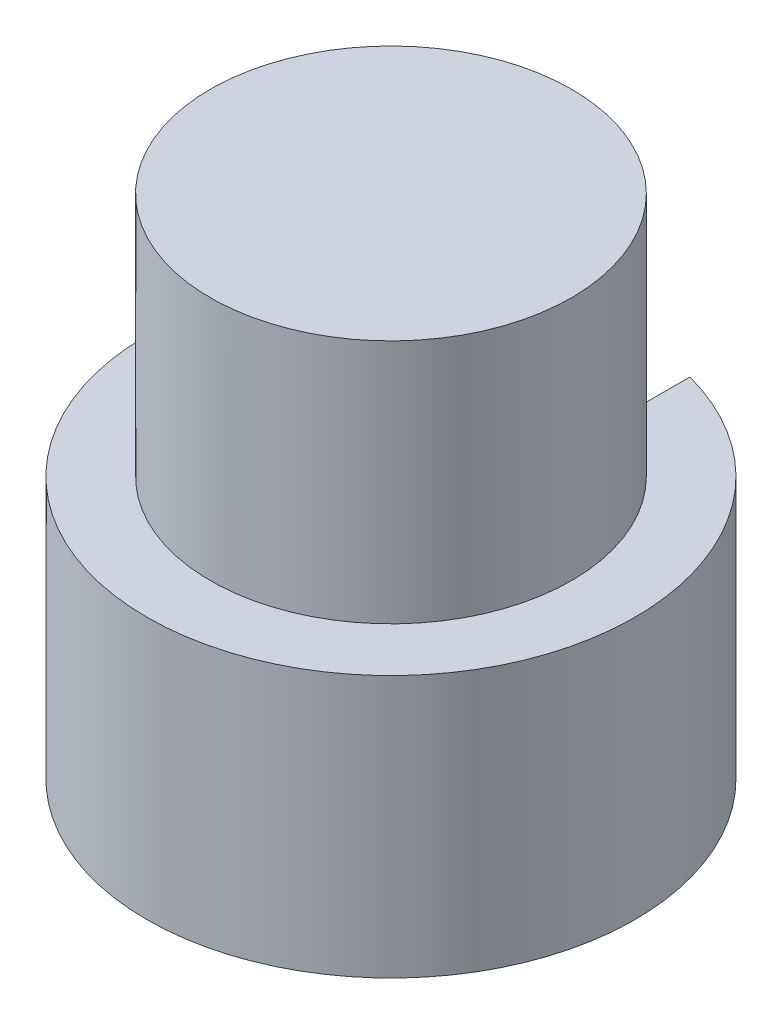
ISO-10303-21;
HEADER;
FILE_DESCRIPTION(('STEP AP214'),'2;1');
FILE_NAME('part.step','',(''),(''),'','','');
FILE_SCHEMA(('AUTOMOTIVE_DESIGN { 1 0 10303 214 1 1 1 1 }'));
ENDSEC;
DATA;
#1=APPLICATION_CONTEXT('core data for automotive mechanical design processes');
#2=APPLICATION_PROTOCOL_DEFINITION('international standard','automotive_design',2000,#1);
#3=PRODUCT_CONTEXT('',#1,'mechanical');
#4=PRODUCT('Part','Part','',(#3));
#5=PRODUCT_RELATED_PRODUCT_CATEGORY('part','',(#4));
#6=PRODUCT_DEFINITION_FORMATION('','',#4);
#7=PRODUCT_DEFINITION_CONTEXT('part definition',#1,'design');
#8=PRODUCT_DEFINITION('design','',#6,#7);
#9=PRODUCT_DEFINITION_SHAPE('','',#8);
#10=(LENGTH_UNIT() NAMED_UNIT(*) SI_UNIT(.MILLI.,.METRE.));
#11=(NAMED_UNIT(*) PLANE_ANGLE_UNIT() SI_UNIT($,.RADIAN.));
#12=(NAMED_UNIT(*) SI_UNIT($,.STERADIAN.) SOLID_ANGLE_UNIT());
#13=UNCERTAINTY_MEASURE_WITH_UNIT(LENGTH_MEASURE(1.E-05),#10,'distance_accuracy_value','');
#14=(GEOMETRIC_REPRESENTATION_CONTEXT(3) GLOBAL_UNCERTAINTY_ASSIGNED_CONTEXT((#13)) GLOBAL_UNIT_ASSIGNED_CONTEXT((#10,
#11,#12)) REPRESENTATION_CONTEXT('',''));
#15=CARTESIAN_POINT('',(0.,0.,0.));
#16=DIRECTION('',(0.,0.,1.));
#17=DIRECTION('',(1.,0.,0.));
#18=AXIS2_PLACEMENT_3D('',#15,#16,#17);
#19=CARTESIAN_POINT('',(0.,12.,0.));
#20=DIRECTION('',(0.,-1.,0.));
#21=DIRECTION('',(0.,0.,1.));
#22=AXIS2_PLACEMENT_3D('',#19,#20,#21);
#23=CYLINDRICAL_SURFACE('',#22,4.275);
#24=CARTESIAN_POINT('',(0.,12.,0.));
#25=DIRECTION('',(0.,-1.,0.));
#26=DIRECTION('',(0.,0.,-1.));
#27=AXIS2_PLACEMENT_3D('',#24,#25,#26);
#28=CIRCLE('',#27,4.275);
#29=CARTESIAN_POINT('',(0.,12.,-4.275));
#30=VERTEX_POINT('',#29);
#31=EDGE_CURVE('E145',#30,#30,#28,.T.);
#32=ORIENTED_EDGE('',*,*,#31,.T.);
#33=EDGE_LOOP('',(#32));
#34=FACE_BOUND('',#33,.T.);
#35=CARTESIAN_POINT('',(0.,6.2,0.));
#36=DIRECTION('',(0.,1.,0.));
#37=DIRECTION('',(0.,0.,1.));
#38=AXIS2_PLACEMENT_3D('',#35,#36,#37);
#39=CIRCLE('',#38,4.275);
#40=CARTESIAN_POINT('',(1.5,6.2,-4.00320184352475));
#41=VERTEX_POINT('',#40);
#42=CARTESIAN_POINT('',(-1.5,6.2,-4.00320184352475));
#43=VERTEX_POINT('',#42);
#44=EDGE_CURVE('E115',#41,#43,#39,.T.);
#45=ORIENTED_EDGE('',*,*,#44,.T.);
#46=EDGE_CURVE('E150',#43,#41,#39,.T.);
#47=ORIENTED_EDGE('',*,*,#46,.T.);
#48=EDGE_LOOP('',(#45,#47));
#49=FACE_BOUND('',#48,.T.);
#50=ADVANCED_FACE('F41',(#34,#49),#23,.T.);
#51=CARTESIAN_POINT('',(0.,12.,0.));
#52=DIRECTION('',(0.,1.,0.));
#53=DIRECTION('',(0.,0.,-1.));
#54=AXIS2_PLACEMENT_3D('',#51,#52,#53);
#55=PLANE('',#54);
#56=ORIENTED_EDGE('',*,*,#31,.F.);
#57=EDGE_LOOP('',(#56));
#58=FACE_BOUND('',#57,.T.);
#59=ADVANCED_FACE('F176',(#58),#55,.T.);
#60=CARTESIAN_POINT('',(0.,6.2,0.));
#61=DIRECTION('',(0.,-1.,0.));
#62=DIRECTION('',(0.,0.,1.));
#63=AXIS2_PLACEMENT_3D('',#60,#61,#62);
#64=CYLINDRICAL_SURFACE('',#63,5.775);
#65=DIRECTION('',(0.,-1.,0.));
#66=VECTOR('',#65,1.);
#67=CARTESIAN_POINT('',(-1.5,6.2,-5.57679343350639));
#68=LINE('',#67,#66);
#69=CARTESIAN_POINT('',(-1.5,6.2,-5.57679343350639));
#70=VERTEX_POINT('',#69);
#71=CARTESIAN_POINT('',(-1.5,0.,-5.57679343350639));
#72=VERTEX_POINT('',#71);
#73=EDGE_CURVE('E132',#70,#72,#68,.T.);
#74=ORIENTED_EDGE('',*,*,#73,.T.);
#75=CARTESIAN_POINT('',(0.,0.,0.));
#76=DIRECTION('',(0.,1.,0.));
#77=DIRECTION('',(0.,0.,1.));
#78=AXIS2_PLACEMENT_3D('',#75,#76,#77);
#79=CIRCLE('',#78,5.775);
#80=CARTESIAN_POINT('',(1.5,0.,-5.57679343350639));
#81=VERTEX_POINT('',#80);
#82=EDGE_CURVE('E139',#72,#81,#79,.T.);
#83=ORIENTED_EDGE('',*,*,#82,.T.);
#84=DIRECTION('',(0.,-1.,0.));
#85=VECTOR('',#84,1.);
#86=CARTESIAN_POINT('',(1.5,6.2,-5.57679343350639));
#87=LINE('',#86,#85);
#88=CARTESIAN_POINT('',(1.5,6.2,-5.57679343350639));
#89=VERTEX_POINT('',#88);
#90=EDGE_CURVE('E127',#81,#89,#87,.F.);
#91=ORIENTED_EDGE('',*,*,#90,.T.);
#92=CARTESIAN_POINT('',(0.,6.2,0.));
#93=DIRECTION('',(0.,1.,0.));
#94=DIRECTION('',(0.,0.,1.));
#95=AXIS2_PLACEMENT_3D('',#92,#93,#94);
#96=CIRCLE('',#95,5.775);
#97=EDGE_CURVE('E142',#70,#89,#96,.T.);
#98=ORIENTED_EDGE('',*,*,#97,.F.);
#99=EDGE_LOOP('',(#74,#83,#91,#98));
#100=FACE_BOUND('',#99,.T.);
#101=ADVANCED_FACE('F168',(#100),#64,.T.);
#102=CARTESIAN_POINT('',(0.,6.2,0.));
#103=DIRECTION('',(0.,-1.,0.));
#104=DIRECTION('',(0.,0.,1.));
#105=AXIS2_PLACEMENT_3D('',#102,#103,#104);
#106=PLANE('',#105);
#107=ORIENTED_EDGE('',*,*,#97,.T.);
#108=DIRECTION('',(0.,0.,-1.));
#109=VECTOR('',#108,1.);
#110=CARTESIAN_POINT('',(1.5,6.2,-2.));
#111=LINE('',#110,#109);
#112=EDGE_CURVE('E117',#41,#89,#111,.T.);
#113=ORIENTED_EDGE('',*,*,#112,.F.);
#114=ORIENTED_EDGE('',*,*,#46,.F.);
#115=DIRECTION('',(0.,0.,-1.));
#116=VECTOR('',#115,1.);
#117=CARTESIAN_POINT('',(-1.5,6.2,-2.));
#118=LINE('',#117,#116);
#119=EDGE_CURVE('E116',#43,#70,#118,.T.);
#120=ORIENTED_EDGE('',*,*,#119,.T.);
#121=EDGE_LOOP('',(#107,#113,#114,#120));
#122=FACE_BOUND('',#121,.T.);
#123=ADVANCED_FACE('F173',(#122),#106,.F.);
#124=CARTESIAN_POINT('',(0.,0.,0.));
#125=DIRECTION('',(0.,1.,0.));
#126=DIRECTION('',(0.,0.,-1.));
#127=AXIS2_PLACEMENT_3D('',#124,#125,#126);
#128=PLANE('',#127);
#129=CARTESIAN_POINT('',(0.,0.,0.));
#130=DIRECTION('',(0.,1.,0.));
#131=DIRECTION('',(0.,0.,1.));
#132=AXIS2_PLACEMENT_3D('',#129,#130,#131);
#133=CIRCLE('',#132,3.05);
#134=CARTESIAN_POINT('',(-1.5,0.,-2.6556543449779));
#135=VERTEX_POINT('',#134);
#136=CARTESIAN_POINT('',(1.5,0.,-2.6556543449779));
#137=VERTEX_POINT('',#136);
#138=EDGE_CURVE('E135',#135,#137,#133,.T.);
#139=ORIENTED_EDGE('',*,*,#138,.T.);
#140=DIRECTION('',(0.,0.,-1.));
#141=VECTOR('',#140,1.);
#142=CARTESIAN_POINT('',(1.5,0.,-2.));
#143=LINE('',#142,#141);
#144=EDGE_CURVE('E121',#137,#81,#143,.T.);
#145=ORIENTED_EDGE('',*,*,#144,.T.);
#146=ORIENTED_EDGE('',*,*,#82,.F.);
#147=DIRECTION('',(0.,0.,-1.));
#148=VECTOR('',#147,1.);
#149=CARTESIAN_POINT('',(-1.5,0.,-2.));
#150=LINE('',#149,#148);
#151=EDGE_CURVE('E110',#135,#72,#150,.T.);
#152=ORIENTED_EDGE('',*,*,#151,.F.);
#153=EDGE_LOOP('',(#139,#145,#146,#152));
#154=FACE_BOUND('',#153,.T.);
#155=ADVANCED_FACE('F165',(#154),#128,.F.);
#156=CARTESIAN_POINT('',(0.,3.,0.));
#157=DIRECTION('',(0.,-1.,0.));
#158=DIRECTION('',(0.,0.,1.));
#159=AXIS2_PLACEMENT_3D('',#156,#157,#158);
#160=CYLINDRICAL_SURFACE('',#159,3.05);
#161=CARTESIAN_POINT('',(0.,3.,0.));
#162=DIRECTION('',(0.,1.,0.));
#163=DIRECTION('',(0.,0.,1.));
#164=AXIS2_PLACEMENT_3D('',#161,#162,#163);
#165=CIRCLE('',#164,3.05);
#166=CARTESIAN_POINT('',(-1.5,3.,-2.6556543449779));
#167=VERTEX_POINT('',#166);
#168=CARTESIAN_POINT('',(1.5,3.,-2.6556543449779));
#169=VERTEX_POINT('',#168);
#170=EDGE_CURVE('E136',#167,#169,#165,.T.);
#171=ORIENTED_EDGE('',*,*,#170,.T.);
#172=DIRECTION('',(0.,-1.,0.));
#173=VECTOR('',#172,1.);
#174=CARTESIAN_POINT('',(1.5,3.,-2.6556543449779));
#175=LINE('',#174,#173);
#176=EDGE_CURVE('E125',#137,#169,#175,.F.);
#177=ORIENTED_EDGE('',*,*,#176,.F.);
#178=ORIENTED_EDGE('',*,*,#138,.F.);
#179=DIRECTION('',(0.,-1.,0.));
#180=VECTOR('',#179,1.);
#181=CARTESIAN_POINT('',(-1.5,3.,-2.6556543449779));
#182=LINE('',#181,#180);
#183=EDGE_CURVE('E130',#167,#135,#182,.T.);
#184=ORIENTED_EDGE('',*,*,#183,.F.);
#185=EDGE_LOOP('',(#171,#177,#178,#184));
#186=FACE_BOUND('',#185,.T.);
#187=ADVANCED_FACE('F159',(#186),#160,.F.);
#188=CARTESIAN_POINT('',(0.,3.,0.));
#189=DIRECTION('',(0.,-1.,0.));
#190=DIRECTION('',(0.,0.,1.));
#191=AXIS2_PLACEMENT_3D('',#188,#189,#190);
#192=PLANE('',#191);
#193=DIRECTION('',(0.,0.,1.));
#194=VECTOR('',#193,1.);
#195=CARTESIAN_POINT('',(-1.5,3.,0.));
#196=LINE('',#195,#194);
#197=CARTESIAN_POINT('',(-1.5,3.,-2.));
#198=VERTEX_POINT('',#197);
#199=EDGE_CURVE('E11',#167,#198,#196,.T.);
#200=ORIENTED_EDGE('',*,*,#199,.T.);
#201=DIRECTION('',(-1.,0.,0.));
#202=VECTOR('',#201,1.);
#203=CARTESIAN_POINT('',(0.,3.,-2.));
#204=LINE('',#203,#202);
#205=CARTESIAN_POINT('',(1.5,3.,-2.));
#206=VERTEX_POINT('',#205);
#207=EDGE_CURVE('E152',#206,#198,#204,.T.);
#208=ORIENTED_EDGE('',*,*,#207,.F.);
#209=DIRECTION('',(0.,0.,-1.));
#210=VECTOR('',#209,1.);
#211=CARTESIAN_POINT('',(1.5,3.,0.));
#212=LINE('',#211,#210);
#213=EDGE_CURVE('E48',#206,#169,#212,.T.);
#214=ORIENTED_EDGE('',*,*,#213,.T.);
#215=ORIENTED_EDGE('',*,*,#170,.F.);
#216=EDGE_LOOP('',(#200,#208,#214,#215));
#217=FACE_BOUND('',#216,.T.);
#218=ADVANCED_FACE('F155',(#217),#192,.T.);
#219=CARTESIAN_POINT('',(-1.5,6.2,-2.));
#220=DIRECTION('',(0.,1.,0.));
#221=DIRECTION('',(0.,0.,-1.));
#222=AXIS2_PLACEMENT_3D('',#219,#220,#221);
#223=PLANE('',#222);
#224=CARTESIAN_POINT('',(-1.5,6.2,-2.));
#225=VERTEX_POINT('',#224);
#226=EDGE_CURVE('E119',#225,#43,#118,.T.);
#227=ORIENTED_EDGE('',*,*,#226,.T.);
#228=ORIENTED_EDGE('',*,*,#44,.F.);
#229=CARTESIAN_POINT('',(1.5,6.2,-2.));
#230=VERTEX_POINT('',#229);
#231=EDGE_CURVE('E100',#230,#41,#111,.T.);
#232=ORIENTED_EDGE('',*,*,#231,.F.);
#233=DIRECTION('',(-1.,0.,0.));
#234=VECTOR('',#233,1.);
#235=CARTESIAN_POINT('',(-1.5,6.2,-2.));
#236=LINE('',#235,#234);
#237=EDGE_CURVE('E105',#230,#225,#236,.T.);
#238=ORIENTED_EDGE('',*,*,#237,.T.);
#239=EDGE_LOOP('',(#227,#228,#232,#238));
#240=FACE_BOUND('',#239,.T.);
#241=ADVANCED_FACE('F113',(#240),#223,.F.);
#242=CARTESIAN_POINT('',(-1.5,6.2,-2.));
#243=DIRECTION('',(-1.,0.,0.));
#244=DIRECTION('',(0.,-1.,0.));
#245=AXIS2_PLACEMENT_3D('',#242,#243,#244);
#246=PLANE('',#245);
#247=ORIENTED_EDGE('',*,*,#73,.F.);
#248=ORIENTED_EDGE('',*,*,#119,.F.);
#249=ORIENTED_EDGE('',*,*,#226,.F.);
#250=DIRECTION('',(0.,-1.,0.));
#251=VECTOR('',#250,1.);
#252=CARTESIAN_POINT('',(-1.5,6.2,-2.));
#253=LINE('',#252,#251);
#254=EDGE_CURVE('E55',#225,#198,#253,.T.);
#255=ORIENTED_EDGE('',*,*,#254,.T.);
#256=ORIENTED_EDGE('',*,*,#199,.F.);
#257=ORIENTED_EDGE('',*,*,#183,.T.);
#258=ORIENTED_EDGE('',*,*,#151,.T.);
#259=EDGE_LOOP('',(#247,#248,#249,#255,#256,#257,#258));
#260=FACE_BOUND('',#259,.T.);
#261=ADVANCED_FACE('F162',(#260),#246,.F.);
#262=CARTESIAN_POINT('',(1.5,6.2,-2.));
#263=DIRECTION('',(1.,0.,0.));
#264=DIRECTION('',(0.,1.,0.));
#265=AXIS2_PLACEMENT_3D('',#262,#263,#264);
#266=PLANE('',#265);
#267=ORIENTED_EDGE('',*,*,#90,.F.);
#268=ORIENTED_EDGE('',*,*,#144,.F.);
#269=ORIENTED_EDGE('',*,*,#176,.T.);
#270=ORIENTED_EDGE('',*,*,#213,.F.);
#271=DIRECTION('',(0.,1.,0.));
#272=VECTOR('',#271,1.);
#273=CARTESIAN_POINT('',(1.5,6.2,-2.));
#274=LINE('',#273,#272);
#275=EDGE_CURVE('E95',#206,#230,#274,.T.);
#276=ORIENTED_EDGE('',*,*,#275,.T.);
#277=ORIENTED_EDGE('',*,*,#231,.T.);
#278=ORIENTED_EDGE('',*,*,#112,.T.);
#279=EDGE_LOOP('',(#267,#268,#269,#270,#276,#277,#278));
#280=FACE_BOUND('',#279,.T.);
#281=ADVANCED_FACE('F98',(#280),#266,.F.);
#282=CARTESIAN_POINT('',(0.,0.,-2.));
#283=DIRECTION('',(0.,0.,-1.));
#284=DIRECTION('',(1.,0.,0.));
#285=AXIS2_PLACEMENT_3D('',#282,#283,#284);
#286=PLANE('',#285);
#287=ORIENTED_EDGE('',*,*,#275,.F.);
#288=ORIENTED_EDGE('',*,*,#207,.T.);
#289=ORIENTED_EDGE('',*,*,#254,.F.);
#290=ORIENTED_EDGE('',*,*,#237,.F.);
#291=EDGE_LOOP('',(#287,#288,#289,#290));
#292=FACE_BOUND('',#291,.T.);
#293=ADVANCED_FACE('F108',(#292),#286,.T.);
#294=CLOSED_SHELL('',(#50,#59,#101,#123,#155,#187,#218,#241,#261,#281,#293));
#295=MANIFOLD_SOLID_BREP('B2',#294);
#296=ADVANCED_BREP_SHAPE_REPRESENTATION('',(#18,#295),#14);
#297=SHAPE_DEFINITION_REPRESENTATION(#9,#296);
ENDSEC;
END-ISO-10303-21;
